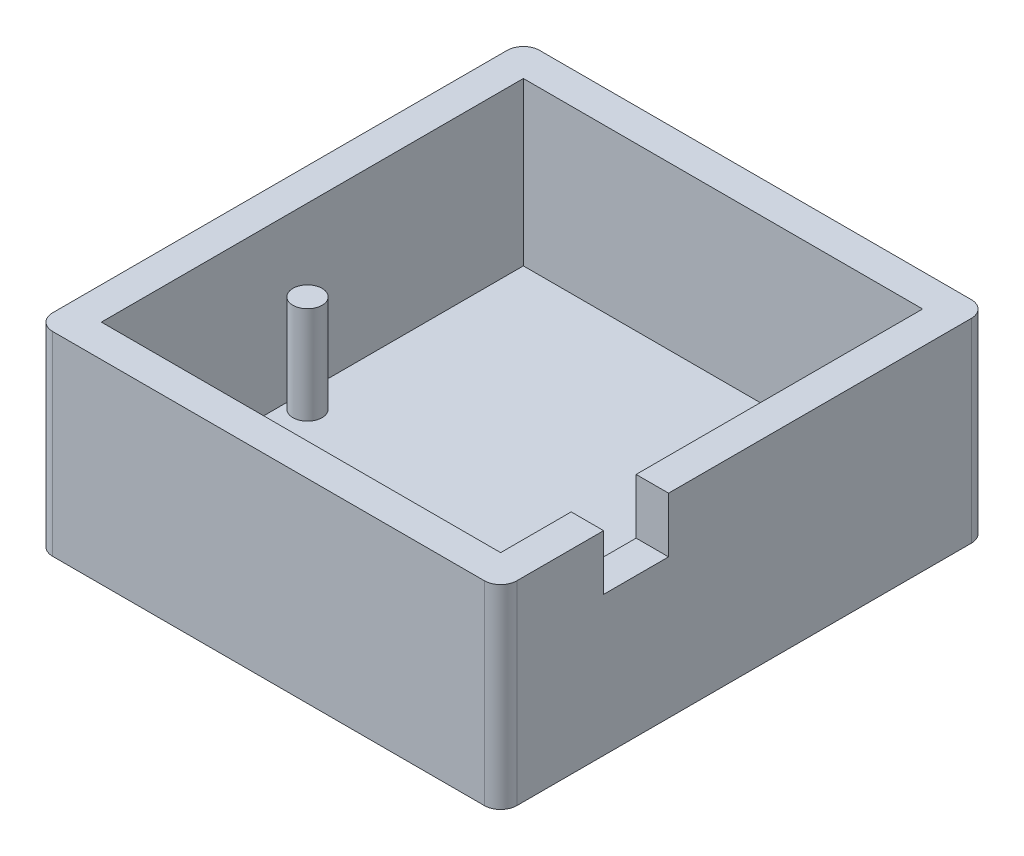
ISO-10303-21;
HEADER;
FILE_DESCRIPTION(('STEP AP214'),'2;1');
FILE_NAME('part.step','',(''),(''),'','','');
FILE_SCHEMA(('AUTOMOTIVE_DESIGN { 1 0 10303 214 1 1 1 1 }'));
ENDSEC;
DATA;
#1=APPLICATION_CONTEXT('core data for automotive mechanical design processes');
#2=APPLICATION_PROTOCOL_DEFINITION('international standard','automotive_design',2000,#1);
#3=PRODUCT_CONTEXT('',#1,'mechanical');
#4=PRODUCT('Part','Part','',(#3));
#5=PRODUCT_RELATED_PRODUCT_CATEGORY('part','',(#4));
#6=PRODUCT_DEFINITION_FORMATION('','',#4);
#7=PRODUCT_DEFINITION_CONTEXT('part definition',#1,'design');
#8=PRODUCT_DEFINITION('design','',#6,#7);
#9=PRODUCT_DEFINITION_SHAPE('','',#8);
#10=(LENGTH_UNIT() NAMED_UNIT(*) SI_UNIT(.MILLI.,.METRE.));
#11=(NAMED_UNIT(*) PLANE_ANGLE_UNIT() SI_UNIT($,.RADIAN.));
#12=(NAMED_UNIT(*) SI_UNIT($,.STERADIAN.) SOLID_ANGLE_UNIT());
#13=UNCERTAINTY_MEASURE_WITH_UNIT(LENGTH_MEASURE(1.E-05),#10,'distance_accuracy_value','');
#14=(GEOMETRIC_REPRESENTATION_CONTEXT(3) GLOBAL_UNCERTAINTY_ASSIGNED_CONTEXT((#13)) GLOBAL_UNIT_ASSIGNED_CONTEXT((#10,
#11,#12)) REPRESENTATION_CONTEXT('',''));
#15=CARTESIAN_POINT('',(0.,0.,0.));
#16=DIRECTION('',(0.,0.,1.));
#17=DIRECTION('',(1.,0.,0.));
#18=AXIS2_PLACEMENT_3D('',#15,#16,#17);
#19=CARTESIAN_POINT('',(0.,20.,0.));
#20=DIRECTION('',(0.,-1.,0.));
#21=DIRECTION('',(0.,0.,-1.));
#22=AXIS2_PLACEMENT_3D('',#19,#20,#21);
#23=PLANE('',#22);
#24=DIRECTION('',(-1.,0.,0.));
#25=VECTOR('',#24,1.);
#26=CARTESIAN_POINT('',(31.8316080107852,20.,9.30673408903629));
#27=LINE('',#26,#25);
#28=CARTESIAN_POINT('',(28.6,20.,9.30673408903629));
#29=VERTEX_POINT('',#28);
#30=CARTESIAN_POINT('',(24.6,20.,9.30673408903629));
#31=VERTEX_POINT('',#30);
#32=EDGE_CURVE('E162',#29,#31,#27,.T.);
#33=ORIENTED_EDGE('',*,*,#32,.F.);
#34=DIRECTION('',(0.,0.,-1.));
#35=VECTOR('',#34,1.);
#36=CARTESIAN_POINT('',(28.6,20.,0.));
#37=LINE('',#36,#35);
#38=CARTESIAN_POINT('',(28.6,20.,-28.));
#39=VERTEX_POINT('',#38);
#40=EDGE_CURVE('E230',#29,#39,#37,.T.);
#41=ORIENTED_EDGE('',*,*,#40,.T.);
#42=CARTESIAN_POINT('',(26.6,20.,-28.));
#43=DIRECTION('',(0.,-1.,0.));
#44=DIRECTION('',(0.,0.,-1.));
#45=AXIS2_PLACEMENT_3D('',#42,#43,#44);
#46=CIRCLE('',#45,2.);
#47=CARTESIAN_POINT('',(26.6,20.,-30.));
#48=VERTEX_POINT('',#47);
#49=EDGE_CURVE('E199',#39,#48,#46,.F.);
#50=ORIENTED_EDGE('',*,*,#49,.T.);
#51=DIRECTION('',(-1.,0.,0.));
#52=VECTOR('',#51,1.);
#53=CARTESIAN_POINT('',(0.,20.,-30.));
#54=LINE('',#53,#52);
#55=CARTESIAN_POINT('',(-26.6,20.,-30.));
#56=VERTEX_POINT('',#55);
#57=EDGE_CURVE('E224',#48,#56,#54,.T.);
#58=ORIENTED_EDGE('',*,*,#57,.T.);
#59=CARTESIAN_POINT('',(-26.6,20.,-28.));
#60=DIRECTION('',(0.,-1.,0.));
#61=DIRECTION('',(0.,0.,-1.));
#62=AXIS2_PLACEMENT_3D('',#59,#60,#61);
#63=CIRCLE('',#62,2.);
#64=CARTESIAN_POINT('',(-28.6,20.,-28.));
#65=VERTEX_POINT('',#64);
#66=EDGE_CURVE('E190',#56,#65,#63,.F.);
#67=ORIENTED_EDGE('',*,*,#66,.T.);
#68=DIRECTION('',(0.,0.,1.));
#69=VECTOR('',#68,1.);
#70=CARTESIAN_POINT('',(-28.6,20.,0.));
#71=LINE('',#70,#69);
#72=CARTESIAN_POINT('',(-28.6,20.,28.));
#73=VERTEX_POINT('',#72);
#74=EDGE_CURVE('E222',#65,#73,#71,.T.);
#75=ORIENTED_EDGE('',*,*,#74,.T.);
#76=CARTESIAN_POINT('',(-26.6,20.,28.));
#77=DIRECTION('',(0.,-1.,0.));
#78=DIRECTION('',(0.,0.,-1.));
#79=AXIS2_PLACEMENT_3D('',#76,#77,#78);
#80=CIRCLE('',#79,2.);
#81=CARTESIAN_POINT('',(-26.6,20.,30.));
#82=VERTEX_POINT('',#81);
#83=EDGE_CURVE('E182',#73,#82,#80,.F.);
#84=ORIENTED_EDGE('',*,*,#83,.T.);
#85=DIRECTION('',(1.,0.,0.));
#86=VECTOR('',#85,1.);
#87=CARTESIAN_POINT('',(0.,20.,30.));
#88=LINE('',#87,#86);
#89=CARTESIAN_POINT('',(26.6,20.,30.));
#90=VERTEX_POINT('',#89);
#91=EDGE_CURVE('E220',#82,#90,#88,.T.);
#92=ORIENTED_EDGE('',*,*,#91,.T.);
#93=CARTESIAN_POINT('',(26.6,20.,28.));
#94=DIRECTION('',(0.,-1.,0.));
#95=DIRECTION('',(0.,0.,-1.));
#96=AXIS2_PLACEMENT_3D('',#93,#94,#95);
#97=CIRCLE('',#96,2.);
#98=CARTESIAN_POINT('',(28.6,20.,28.));
#99=VERTEX_POINT('',#98);
#100=EDGE_CURVE('E209',#90,#99,#97,.F.);
#101=ORIENTED_EDGE('',*,*,#100,.T.);
#102=CARTESIAN_POINT('',(28.6,20.,17.3067340890363));
#103=VERTEX_POINT('',#102);
#104=EDGE_CURVE('E227',#99,#103,#37,.T.);
#105=ORIENTED_EDGE('',*,*,#104,.T.);
#106=DIRECTION('',(1.,0.,0.));
#107=VECTOR('',#106,1.);
#108=CARTESIAN_POINT('',(31.8316080107852,20.,17.3067340890363));
#109=LINE('',#108,#107);
#110=CARTESIAN_POINT('',(24.6,20.,17.3067340890363));
#111=VERTEX_POINT('',#110);
#112=EDGE_CURVE('E155',#111,#103,#109,.T.);
#113=ORIENTED_EDGE('',*,*,#112,.F.);
#114=DIRECTION('',(0.,0.,-1.));
#115=VECTOR('',#114,1.);
#116=CARTESIAN_POINT('',(24.6,20.,26.));
#117=LINE('',#116,#115);
#118=CARTESIAN_POINT('',(24.6,20.,26.));
#119=VERTEX_POINT('',#118);
#120=EDGE_CURVE('E168',#119,#111,#117,.T.);
#121=ORIENTED_EDGE('',*,*,#120,.F.);
#122=DIRECTION('',(1.,0.,0.));
#123=VECTOR('',#122,1.);
#124=CARTESIAN_POINT('',(-24.6,20.,26.));
#125=LINE('',#124,#123);
#126=CARTESIAN_POINT('',(-24.6,20.,26.));
#127=VERTEX_POINT('',#126);
#128=EDGE_CURVE('E253',#127,#119,#125,.T.);
#129=ORIENTED_EDGE('',*,*,#128,.F.);
#130=DIRECTION('',(0.,0.,1.));
#131=VECTOR('',#130,1.);
#132=CARTESIAN_POINT('',(-24.6,20.,26.));
#133=LINE('',#132,#131);
#134=CARTESIAN_POINT('',(-24.6,20.,-26.));
#135=VERTEX_POINT('',#134);
#136=EDGE_CURVE('E266',#135,#127,#133,.T.);
#137=ORIENTED_EDGE('',*,*,#136,.F.);
#138=DIRECTION('',(-1.,0.,0.));
#139=VECTOR('',#138,1.);
#140=CARTESIAN_POINT('',(-24.6,20.,-26.));
#141=LINE('',#140,#139);
#142=CARTESIAN_POINT('',(24.6,20.,-26.));
#143=VERTEX_POINT('',#142);
#144=EDGE_CURVE('E269',#143,#135,#141,.T.);
#145=ORIENTED_EDGE('',*,*,#144,.F.);
#146=EDGE_CURVE('E256',#31,#143,#117,.T.);
#147=ORIENTED_EDGE('',*,*,#146,.F.);
#148=EDGE_LOOP('',(#33,#41,#50,#58,#67,#75,#84,#92,#101,#105,#113,#121,#129,#137,#145,#147));
#149=FACE_BOUND('',#148,.T.);
#150=ADVANCED_FACE('F33',(#149),#23,.F.);
#151=CARTESIAN_POINT('',(28.6,20.,26.));
#152=DIRECTION('',(-1.,0.,0.));
#153=DIRECTION('',(0.,0.,1.));
#154=AXIS2_PLACEMENT_3D('',#151,#152,#153);
#155=PLANE('',#154);
#156=DIRECTION('',(0.,1.,0.));
#157=VECTOR('',#156,1.);
#158=CARTESIAN_POINT('',(28.6,20.,9.30673408903629));
#159=LINE('',#158,#157);
#160=CARTESIAN_POINT('',(28.6,13.2,9.30673408903629));
#161=VERTEX_POINT('',#160);
#162=EDGE_CURVE('E283',#161,#29,#159,.T.);
#163=ORIENTED_EDGE('',*,*,#162,.F.);
#164=DIRECTION('',(0.,0.,1.));
#165=VECTOR('',#164,1.);
#166=CARTESIAN_POINT('',(28.6,13.2,26.));
#167=LINE('',#166,#165);
#168=CARTESIAN_POINT('',(28.6,13.2,17.3067340890363));
#169=VERTEX_POINT('',#168);
#170=EDGE_CURVE('E154',#161,#169,#167,.T.);
#171=ORIENTED_EDGE('',*,*,#170,.T.);
#172=DIRECTION('',(0.,-1.,0.));
#173=VECTOR('',#172,1.);
#174=CARTESIAN_POINT('',(28.6,20.,17.3067340890363));
#175=LINE('',#174,#173);
#176=EDGE_CURVE('E161',#103,#169,#175,.T.);
#177=ORIENTED_EDGE('',*,*,#176,.F.);
#178=ORIENTED_EDGE('',*,*,#104,.F.);
#179=DIRECTION('',(0.,-1.,0.));
#180=VECTOR('',#179,1.);
#181=CARTESIAN_POINT('',(28.6,20.,28.));
#182=LINE('',#181,#180);
#183=CARTESIAN_POINT('',(28.6,-4.,28.));
#184=VERTEX_POINT('',#183);
#185=EDGE_CURVE('E217',#99,#184,#182,.T.);
#186=ORIENTED_EDGE('',*,*,#185,.T.);
#187=DIRECTION('',(0.,0.,-1.));
#188=VECTOR('',#187,1.);
#189=CARTESIAN_POINT('',(28.6,-4.,0.));
#190=LINE('',#189,#188);
#191=CARTESIAN_POINT('',(28.6,-4.,-28.));
#192=VERTEX_POINT('',#191);
#193=EDGE_CURVE('E238',#184,#192,#190,.T.);
#194=ORIENTED_EDGE('',*,*,#193,.T.);
#195=DIRECTION('',(0.,-1.,0.));
#196=VECTOR('',#195,1.);
#197=CARTESIAN_POINT('',(28.6,20.,-28.));
#198=LINE('',#197,#196);
#199=EDGE_CURVE('E201',#192,#39,#198,.F.);
#200=ORIENTED_EDGE('',*,*,#199,.T.);
#201=ORIENTED_EDGE('',*,*,#40,.F.);
#202=EDGE_LOOP('',(#163,#171,#177,#178,#186,#194,#200,#201));
#203=FACE_BOUND('',#202,.T.);
#204=ADVANCED_FACE('F314',(#203),#155,.F.);
#205=CARTESIAN_POINT('',(24.6,20.,26.));
#206=DIRECTION('',(-1.,0.,0.));
#207=DIRECTION('',(0.,0.,1.));
#208=AXIS2_PLACEMENT_3D('',#205,#206,#207);
#209=PLANE('',#208);
#210=DIRECTION('',(0.,0.,-1.));
#211=VECTOR('',#210,1.);
#212=CARTESIAN_POINT('',(24.6,13.2,26.));
#213=LINE('',#212,#211);
#214=CARTESIAN_POINT('',(24.6,13.2,17.3067340890363));
#215=VERTEX_POINT('',#214);
#216=CARTESIAN_POINT('',(24.6,13.2,9.30673408903629));
#217=VERTEX_POINT('',#216);
#218=EDGE_CURVE('E147',#215,#217,#213,.T.);
#219=ORIENTED_EDGE('',*,*,#218,.T.);
#220=DIRECTION('',(0.,1.,0.));
#221=VECTOR('',#220,1.);
#222=CARTESIAN_POINT('',(24.6,20.,9.30673408903629));
#223=LINE('',#222,#221);
#224=EDGE_CURVE('E11',#217,#31,#223,.T.);
#225=ORIENTED_EDGE('',*,*,#224,.T.);
#226=ORIENTED_EDGE('',*,*,#146,.T.);
#227=DIRECTION('',(0.,-1.,0.));
#228=VECTOR('',#227,1.);
#229=CARTESIAN_POINT('',(24.6,20.,-26.));
#230=LINE('',#229,#228);
#231=CARTESIAN_POINT('',(24.6,0.,-26.));
#232=VERTEX_POINT('',#231);
#233=EDGE_CURVE('E241',#143,#232,#230,.T.);
#234=ORIENTED_EDGE('',*,*,#233,.T.);
#235=DIRECTION('',(0.,0.,-1.));
#236=VECTOR('',#235,1.);
#237=CARTESIAN_POINT('',(24.6,0.,26.));
#238=LINE('',#237,#236);
#239=CARTESIAN_POINT('',(24.6,0.,26.));
#240=VERTEX_POINT('',#239);
#241=EDGE_CURVE('E261',#240,#232,#238,.T.);
#242=ORIENTED_EDGE('',*,*,#241,.F.);
#243=DIRECTION('',(0.,-1.,0.));
#244=VECTOR('',#243,1.);
#245=CARTESIAN_POINT('',(24.6,20.,26.));
#246=LINE('',#245,#244);
#247=EDGE_CURVE('E250',#119,#240,#246,.T.);
#248=ORIENTED_EDGE('',*,*,#247,.F.);
#249=ORIENTED_EDGE('',*,*,#120,.T.);
#250=DIRECTION('',(0.,-1.,0.));
#251=VECTOR('',#250,1.);
#252=CARTESIAN_POINT('',(24.6,20.,17.3067340890363));
#253=LINE('',#252,#251);
#254=EDGE_CURVE('E41',#111,#215,#253,.T.);
#255=ORIENTED_EDGE('',*,*,#254,.T.);
#256=EDGE_LOOP('',(#219,#225,#226,#234,#242,#248,#249,#255));
#257=FACE_BOUND('',#256,.T.);
#258=ADVANCED_FACE('F165',(#257),#209,.T.);
#259=CARTESIAN_POINT('',(0.,0.,0.));
#260=DIRECTION('',(0.,-1.,0.));
#261=DIRECTION('',(0.,0.,-1.));
#262=AXIS2_PLACEMENT_3D('',#259,#260,#261);
#263=PLANE('',#262);
#264=CARTESIAN_POINT('',(-22.6,0.,24.));
#265=DIRECTION('',(0.,-1.,0.));
#266=DIRECTION('',(0.,0.,-1.));
#267=AXIS2_PLACEMENT_3D('',#264,#265,#266);
#268=CIRCLE('',#267,1.8);
#269=CARTESIAN_POINT('',(-22.6,0.,22.2));
#270=VERTEX_POINT('',#269);
#271=EDGE_CURVE('E171',#270,#270,#268,.F.);
#272=ORIENTED_EDGE('',*,*,#271,.F.);
#273=EDGE_LOOP('',(#272));
#274=FACE_BOUND('',#273,.T.);
#275=CARTESIAN_POINT('',(-22.6,0.,2.6));
#276=DIRECTION('',(0.,-1.,0.));
#277=DIRECTION('',(0.,0.,-1.));
#278=AXIS2_PLACEMENT_3D('',#275,#276,#277);
#279=CIRCLE('',#278,1.8);
#280=CARTESIAN_POINT('',(-22.6,0.,0.800000000000004));
#281=VERTEX_POINT('',#280);
#282=EDGE_CURVE('E179',#281,#281,#279,.F.);
#283=ORIENTED_EDGE('',*,*,#282,.F.);
#284=EDGE_LOOP('',(#283));
#285=FACE_BOUND('',#284,.T.);
#286=ORIENTED_EDGE('',*,*,#241,.T.);
#287=DIRECTION('',(-1.,0.,0.));
#288=VECTOR('',#287,1.);
#289=CARTESIAN_POINT('',(-24.6,0.,-26.));
#290=LINE('',#289,#288);
#291=CARTESIAN_POINT('',(-24.6,0.,-26.));
#292=VERTEX_POINT('',#291);
#293=EDGE_CURVE('E259',#232,#292,#290,.T.);
#294=ORIENTED_EDGE('',*,*,#293,.T.);
#295=DIRECTION('',(0.,0.,1.));
#296=VECTOR('',#295,1.);
#297=CARTESIAN_POINT('',(-24.6,0.,26.));
#298=LINE('',#297,#296);
#299=CARTESIAN_POINT('',(-24.6,0.,26.));
#300=VERTEX_POINT('',#299);
#301=EDGE_CURVE('E257',#292,#300,#298,.T.);
#302=ORIENTED_EDGE('',*,*,#301,.T.);
#303=DIRECTION('',(1.,0.,0.));
#304=VECTOR('',#303,1.);
#305=CARTESIAN_POINT('',(-24.6,0.,26.));
#306=LINE('',#305,#304);
#307=EDGE_CURVE('E254',#300,#240,#306,.T.);
#308=ORIENTED_EDGE('',*,*,#307,.T.);
#309=EDGE_LOOP('',(#286,#294,#302,#308));
#310=FACE_BOUND('',#309,.T.);
#311=CARTESIAN_POINT('',(22.6,0.,2.6));
#312=DIRECTION('',(0.,-1.,0.));
#313=DIRECTION('',(0.,0.,-1.));
#314=AXIS2_PLACEMENT_3D('',#311,#312,#313);
#315=CIRCLE('',#314,1.8);
#316=CARTESIAN_POINT('',(22.6,0.,0.800000000000004));
#317=VERTEX_POINT('',#316);
#318=EDGE_CURVE('E176',#317,#317,#315,.F.);
#319=ORIENTED_EDGE('',*,*,#318,.F.);
#320=EDGE_LOOP('',(#319));
#321=FACE_BOUND('',#320,.T.);
#322=CARTESIAN_POINT('',(22.6,0.,24.));
#323=DIRECTION('',(0.,-1.,0.));
#324=DIRECTION('',(0.,0.,-1.));
#325=AXIS2_PLACEMENT_3D('',#322,#323,#324);
#326=CIRCLE('',#325,1.8);
#327=CARTESIAN_POINT('',(22.6,0.,22.2));
#328=VERTEX_POINT('',#327);
#329=EDGE_CURVE('E169',#328,#328,#326,.F.);
#330=ORIENTED_EDGE('',*,*,#329,.F.);
#331=EDGE_LOOP('',(#330));
#332=FACE_BOUND('',#331,.T.);
#333=ADVANCED_FACE('F308',(#274,#285,#310,#321,#332),#263,.F.);
#334=CARTESIAN_POINT('',(-24.6,20.,-30.));
#335=DIRECTION('',(0.,0.,1.));
#336=DIRECTION('',(1.,0.,0.));
#337=AXIS2_PLACEMENT_3D('',#334,#335,#336);
#338=PLANE('',#337);
#339=DIRECTION('',(-1.,0.,0.));
#340=VECTOR('',#339,1.);
#341=CARTESIAN_POINT('',(0.,-4.,-30.));
#342=LINE('',#341,#340);
#343=CARTESIAN_POINT('',(26.6,-4.,-30.));
#344=VERTEX_POINT('',#343);
#345=CARTESIAN_POINT('',(-26.6,-4.,-30.));
#346=VERTEX_POINT('',#345);
#347=EDGE_CURVE('E235',#344,#346,#342,.T.);
#348=ORIENTED_EDGE('',*,*,#347,.T.);
#349=DIRECTION('',(0.,-1.,0.));
#350=VECTOR('',#349,1.);
#351=CARTESIAN_POINT('',(-26.6,20.,-30.));
#352=LINE('',#351,#350);
#353=EDGE_CURVE('E192',#346,#56,#352,.F.);
#354=ORIENTED_EDGE('',*,*,#353,.T.);
#355=ORIENTED_EDGE('',*,*,#57,.F.);
#356=DIRECTION('',(0.,-1.,0.));
#357=VECTOR('',#356,1.);
#358=CARTESIAN_POINT('',(26.6,20.,-30.));
#359=LINE('',#358,#357);
#360=EDGE_CURVE('E206',#48,#344,#359,.T.);
#361=ORIENTED_EDGE('',*,*,#360,.T.);
#362=EDGE_LOOP('',(#348,#354,#355,#361));
#363=FACE_BOUND('',#362,.T.);
#364=ADVANCED_FACE('F323',(#363),#338,.F.);
#365=CARTESIAN_POINT('',(-28.6,20.,26.));
#366=DIRECTION('',(1.,0.,0.));
#367=DIRECTION('',(0.,0.,-1.));
#368=AXIS2_PLACEMENT_3D('',#365,#366,#367);
#369=PLANE('',#368);
#370=DIRECTION('',(0.,0.,1.));
#371=VECTOR('',#370,1.);
#372=CARTESIAN_POINT('',(-28.6,-4.,0.));
#373=LINE('',#372,#371);
#374=CARTESIAN_POINT('',(-28.6,-4.,-28.));
#375=VERTEX_POINT('',#374);
#376=CARTESIAN_POINT('',(-28.6,-4.,28.));
#377=VERTEX_POINT('',#376);
#378=EDGE_CURVE('E233',#375,#377,#373,.T.);
#379=ORIENTED_EDGE('',*,*,#378,.T.);
#380=DIRECTION('',(0.,-1.,0.));
#381=VECTOR('',#380,1.);
#382=CARTESIAN_POINT('',(-28.6,20.,28.));
#383=LINE('',#382,#381);
#384=EDGE_CURVE('E56',#377,#73,#383,.F.);
#385=ORIENTED_EDGE('',*,*,#384,.T.);
#386=ORIENTED_EDGE('',*,*,#74,.F.);
#387=DIRECTION('',(0.,-1.,0.));
#388=VECTOR('',#387,1.);
#389=CARTESIAN_POINT('',(-28.6,20.,-28.));
#390=LINE('',#389,#388);
#391=EDGE_CURVE('E196',#65,#375,#390,.T.);
#392=ORIENTED_EDGE('',*,*,#391,.T.);
#393=EDGE_LOOP('',(#379,#385,#386,#392));
#394=FACE_BOUND('',#393,.T.);
#395=ADVANCED_FACE('F343',(#394),#369,.F.);
#396=CARTESIAN_POINT('',(-24.6,20.,30.));
#397=DIRECTION('',(0.,0.,-1.));
#398=DIRECTION('',(-1.,0.,0.));
#399=AXIS2_PLACEMENT_3D('',#396,#397,#398);
#400=PLANE('',#399);
#401=ORIENTED_EDGE('',*,*,#91,.F.);
#402=DIRECTION('',(0.,-1.,0.));
#403=VECTOR('',#402,1.);
#404=CARTESIAN_POINT('',(-26.6,20.,30.));
#405=LINE('',#404,#403);
#406=CARTESIAN_POINT('',(-26.6,-4.,30.));
#407=VERTEX_POINT('',#406);
#408=EDGE_CURVE('E187',#82,#407,#405,.T.);
#409=ORIENTED_EDGE('',*,*,#408,.T.);
#410=DIRECTION('',(1.,0.,0.));
#411=VECTOR('',#410,1.);
#412=CARTESIAN_POINT('',(0.,-4.,30.));
#413=LINE('',#412,#411);
#414=CARTESIAN_POINT('',(26.6,-4.,30.));
#415=VERTEX_POINT('',#414);
#416=EDGE_CURVE('E231',#407,#415,#413,.T.);
#417=ORIENTED_EDGE('',*,*,#416,.T.);
#418=DIRECTION('',(0.,-1.,0.));
#419=VECTOR('',#418,1.);
#420=CARTESIAN_POINT('',(26.6,20.,30.));
#421=LINE('',#420,#419);
#422=EDGE_CURVE('E211',#415,#90,#421,.F.);
#423=ORIENTED_EDGE('',*,*,#422,.T.);
#424=EDGE_LOOP('',(#401,#409,#417,#423));
#425=FACE_BOUND('',#424,.T.);
#426=ADVANCED_FACE('F338',(#425),#400,.F.);
#427=CARTESIAN_POINT('',(0.,-4.,0.));
#428=DIRECTION('',(0.,-1.,0.));
#429=DIRECTION('',(0.,0.,-1.));
#430=AXIS2_PLACEMENT_3D('',#427,#428,#429);
#431=PLANE('',#430);
#432=ORIENTED_EDGE('',*,*,#416,.F.);
#433=CARTESIAN_POINT('',(-26.6,-4.,28.));
#434=DIRECTION('',(0.,-1.,0.));
#435=DIRECTION('',(0.,0.,-1.));
#436=AXIS2_PLACEMENT_3D('',#433,#434,#435);
#437=CIRCLE('',#436,2.);
#438=EDGE_CURVE('E185',#407,#377,#437,.T.);
#439=ORIENTED_EDGE('',*,*,#438,.T.);
#440=ORIENTED_EDGE('',*,*,#378,.F.);
#441=CARTESIAN_POINT('',(-26.6,-4.,-28.));
#442=DIRECTION('',(0.,-1.,0.));
#443=DIRECTION('',(0.,0.,-1.));
#444=AXIS2_PLACEMENT_3D('',#441,#442,#443);
#445=CIRCLE('',#444,2.);
#446=EDGE_CURVE('E194',#375,#346,#445,.T.);
#447=ORIENTED_EDGE('',*,*,#446,.T.);
#448=ORIENTED_EDGE('',*,*,#347,.F.);
#449=CARTESIAN_POINT('',(26.6,-4.,-28.));
#450=DIRECTION('',(0.,-1.,0.));
#451=DIRECTION('',(0.,0.,-1.));
#452=AXIS2_PLACEMENT_3D('',#449,#450,#451);
#453=CIRCLE('',#452,2.);
#454=EDGE_CURVE('E204',#344,#192,#453,.T.);
#455=ORIENTED_EDGE('',*,*,#454,.T.);
#456=ORIENTED_EDGE('',*,*,#193,.F.);
#457=CARTESIAN_POINT('',(26.6,-4.,28.));
#458=DIRECTION('',(0.,-1.,0.));
#459=DIRECTION('',(0.,0.,-1.));
#460=AXIS2_PLACEMENT_3D('',#457,#458,#459);
#461=CIRCLE('',#460,2.);
#462=EDGE_CURVE('E214',#184,#415,#461,.T.);
#463=ORIENTED_EDGE('',*,*,#462,.T.);
#464=EDGE_LOOP('',(#432,#439,#440,#447,#448,#455,#456,#463));
#465=FACE_BOUND('',#464,.T.);
#466=ADVANCED_FACE('F330',(#465),#431,.T.);
#467=CARTESIAN_POINT('',(-24.6,20.,-26.));
#468=DIRECTION('',(0.,0.,1.));
#469=DIRECTION('',(1.,0.,0.));
#470=AXIS2_PLACEMENT_3D('',#467,#468,#469);
#471=PLANE('',#470);
#472=ORIENTED_EDGE('',*,*,#293,.F.);
#473=ORIENTED_EDGE('',*,*,#233,.F.);
#474=ORIENTED_EDGE('',*,*,#144,.T.);
#475=DIRECTION('',(0.,-1.,0.));
#476=VECTOR('',#475,1.);
#477=CARTESIAN_POINT('',(-24.6,20.,-26.));
#478=LINE('',#477,#476);
#479=EDGE_CURVE('E244',#135,#292,#478,.T.);
#480=ORIENTED_EDGE('',*,*,#479,.T.);
#481=EDGE_LOOP('',(#472,#473,#474,#480));
#482=FACE_BOUND('',#481,.T.);
#483=ADVANCED_FACE('F302',(#482),#471,.T.);
#484=CARTESIAN_POINT('',(-24.6,20.,26.));
#485=DIRECTION('',(1.,0.,0.));
#486=DIRECTION('',(0.,0.,-1.));
#487=AXIS2_PLACEMENT_3D('',#484,#485,#486);
#488=PLANE('',#487);
#489=ORIENTED_EDGE('',*,*,#301,.F.);
#490=ORIENTED_EDGE('',*,*,#479,.F.);
#491=ORIENTED_EDGE('',*,*,#136,.T.);
#492=DIRECTION('',(0.,-1.,0.));
#493=VECTOR('',#492,1.);
#494=CARTESIAN_POINT('',(-24.6,20.,26.));
#495=LINE('',#494,#493);
#496=EDGE_CURVE('E247',#127,#300,#495,.T.);
#497=ORIENTED_EDGE('',*,*,#496,.T.);
#498=EDGE_LOOP('',(#489,#490,#491,#497));
#499=FACE_BOUND('',#498,.T.);
#500=ADVANCED_FACE('F305',(#499),#488,.T.);
#501=CARTESIAN_POINT('',(-24.6,20.,26.));
#502=DIRECTION('',(0.,0.,-1.));
#503=DIRECTION('',(-1.,0.,0.));
#504=AXIS2_PLACEMENT_3D('',#501,#502,#503);
#505=PLANE('',#504);
#506=ORIENTED_EDGE('',*,*,#307,.F.);
#507=ORIENTED_EDGE('',*,*,#496,.F.);
#508=ORIENTED_EDGE('',*,*,#128,.T.);
#509=ORIENTED_EDGE('',*,*,#247,.T.);
#510=EDGE_LOOP('',(#506,#507,#508,#509));
#511=FACE_BOUND('',#510,.T.);
#512=ADVANCED_FACE('F371',(#511),#505,.T.);
#513=CARTESIAN_POINT('',(26.6,20.,28.));
#514=DIRECTION('',(0.,-1.,0.));
#515=DIRECTION('',(0.,0.,-1.));
#516=AXIS2_PLACEMENT_3D('',#513,#514,#515);
#517=CYLINDRICAL_SURFACE('',#516,2.);
#518=ORIENTED_EDGE('',*,*,#100,.F.);
#519=ORIENTED_EDGE('',*,*,#422,.F.);
#520=ORIENTED_EDGE('',*,*,#462,.F.);
#521=ORIENTED_EDGE('',*,*,#185,.F.);
#522=EDGE_LOOP('',(#518,#519,#520,#521));
#523=FACE_BOUND('',#522,.T.);
#524=ADVANCED_FACE('F333',(#523),#517,.T.);
#525=CARTESIAN_POINT('',(26.6,20.,-28.));
#526=DIRECTION('',(0.,-1.,0.));
#527=DIRECTION('',(0.,0.,-1.));
#528=AXIS2_PLACEMENT_3D('',#525,#526,#527);
#529=CYLINDRICAL_SURFACE('',#528,2.);
#530=ORIENTED_EDGE('',*,*,#49,.F.);
#531=ORIENTED_EDGE('',*,*,#199,.F.);
#532=ORIENTED_EDGE('',*,*,#454,.F.);
#533=ORIENTED_EDGE('',*,*,#360,.F.);
#534=EDGE_LOOP('',(#530,#531,#532,#533));
#535=FACE_BOUND('',#534,.T.);
#536=ADVANCED_FACE('F326',(#535),#529,.T.);
#537=CARTESIAN_POINT('',(-26.6,20.,-28.));
#538=DIRECTION('',(0.,-1.,0.));
#539=DIRECTION('',(0.,0.,-1.));
#540=AXIS2_PLACEMENT_3D('',#537,#538,#539);
#541=CYLINDRICAL_SURFACE('',#540,2.);
#542=ORIENTED_EDGE('',*,*,#66,.F.);
#543=ORIENTED_EDGE('',*,*,#353,.F.);
#544=ORIENTED_EDGE('',*,*,#446,.F.);
#545=ORIENTED_EDGE('',*,*,#391,.F.);
#546=EDGE_LOOP('',(#542,#543,#544,#545));
#547=FACE_BOUND('',#546,.T.);
#548=ADVANCED_FACE('F345',(#547),#541,.T.);
#549=CARTESIAN_POINT('',(-26.6,20.,28.));
#550=DIRECTION('',(0.,-1.,0.));
#551=DIRECTION('',(0.,0.,-1.));
#552=AXIS2_PLACEMENT_3D('',#549,#550,#551);
#553=CYLINDRICAL_SURFACE('',#552,2.);
#554=ORIENTED_EDGE('',*,*,#83,.F.);
#555=ORIENTED_EDGE('',*,*,#384,.F.);
#556=ORIENTED_EDGE('',*,*,#438,.F.);
#557=ORIENTED_EDGE('',*,*,#408,.F.);
#558=EDGE_LOOP('',(#554,#555,#556,#557));
#559=FACE_BOUND('',#558,.T.);
#560=ADVANCED_FACE('F35',(#559),#553,.T.);
#561=CARTESIAN_POINT('',(-22.6,12.,2.6));
#562=DIRECTION('',(0.,-1.,0.));
#563=DIRECTION('',(0.,0.,-1.));
#564=AXIS2_PLACEMENT_3D('',#561,#562,#563);
#565=CYLINDRICAL_SURFACE('',#564,1.8);
#566=CARTESIAN_POINT('',(-22.6,12.,2.6));
#567=DIRECTION('',(0.,1.,0.));
#568=DIRECTION('',(0.,0.,1.));
#569=AXIS2_PLACEMENT_3D('',#566,#567,#568);
#570=CIRCLE('',#569,1.8);
#571=CARTESIAN_POINT('',(-22.6,12.,4.40000000000001));
#572=VERTEX_POINT('',#571);
#573=EDGE_CURVE('E264',#572,#572,#570,.T.);
#574=ORIENTED_EDGE('',*,*,#573,.F.);
#575=EDGE_LOOP('',(#574));
#576=FACE_BOUND('',#575,.T.);
#577=ORIENTED_EDGE('',*,*,#282,.T.);
#578=EDGE_LOOP('',(#577));
#579=FACE_BOUND('',#578,.T.);
#580=ADVANCED_FACE('F351',(#576,#579),#565,.T.);
#581=CARTESIAN_POINT('',(-22.6,12.,2.6));
#582=DIRECTION('',(0.,1.,0.));
#583=DIRECTION('',(0.,0.,1.));
#584=AXIS2_PLACEMENT_3D('',#581,#582,#583);
#585=PLANE('',#584);
#586=ORIENTED_EDGE('',*,*,#573,.T.);
#587=EDGE_LOOP('',(#586));
#588=FACE_BOUND('',#587,.T.);
#589=ADVANCED_FACE('F406',(#588),#585,.T.);
#590=CARTESIAN_POINT('',(22.6,12.,2.6));
#591=DIRECTION('',(0.,-1.,0.));
#592=DIRECTION('',(0.,0.,-1.));
#593=AXIS2_PLACEMENT_3D('',#590,#591,#592);
#594=CYLINDRICAL_SURFACE('',#593,1.8);
#595=CARTESIAN_POINT('',(22.6,12.,2.6));
#596=DIRECTION('',(0.,1.,0.));
#597=DIRECTION('',(0.,0.,1.));
#598=AXIS2_PLACEMENT_3D('',#595,#596,#597);
#599=CIRCLE('',#598,1.8);
#600=CARTESIAN_POINT('',(22.6,12.,4.40000000000001));
#601=VERTEX_POINT('',#600);
#602=EDGE_CURVE('E274',#601,#601,#599,.T.);
#603=ORIENTED_EDGE('',*,*,#602,.F.);
#604=EDGE_LOOP('',(#603));
#605=FACE_BOUND('',#604,.T.);
#606=ORIENTED_EDGE('',*,*,#318,.T.);
#607=EDGE_LOOP('',(#606));
#608=FACE_BOUND('',#607,.T.);
#609=ADVANCED_FACE('F411',(#605,#608),#594,.T.);
#610=CARTESIAN_POINT('',(22.6,12.,2.6));
#611=DIRECTION('',(0.,1.,0.));
#612=DIRECTION('',(0.,0.,1.));
#613=AXIS2_PLACEMENT_3D('',#610,#611,#612);
#614=PLANE('',#613);
#615=ORIENTED_EDGE('',*,*,#602,.T.);
#616=EDGE_LOOP('',(#615));
#617=FACE_BOUND('',#616,.T.);
#618=ADVANCED_FACE('F421',(#617),#614,.T.);
#619=CARTESIAN_POINT('',(-22.6,12.,24.));
#620=DIRECTION('',(0.,-1.,0.));
#621=DIRECTION('',(0.,0.,-1.));
#622=AXIS2_PLACEMENT_3D('',#619,#620,#621);
#623=CYLINDRICAL_SURFACE('',#622,1.8);
#624=CARTESIAN_POINT('',(-22.6,12.,24.));
#625=DIRECTION('',(0.,1.,0.));
#626=DIRECTION('',(0.,0.,1.));
#627=AXIS2_PLACEMENT_3D('',#624,#625,#626);
#628=CIRCLE('',#627,1.8);
#629=CARTESIAN_POINT('',(-22.6,12.,25.8));
#630=VERTEX_POINT('',#629);
#631=EDGE_CURVE('E277',#630,#630,#628,.T.);
#632=ORIENTED_EDGE('',*,*,#631,.F.);
#633=EDGE_LOOP('',(#632));
#634=FACE_BOUND('',#633,.T.);
#635=ORIENTED_EDGE('',*,*,#271,.T.);
#636=EDGE_LOOP('',(#635));
#637=FACE_BOUND('',#636,.T.);
#638=ADVANCED_FACE('F426',(#634,#637),#623,.T.);
#639=CARTESIAN_POINT('',(-22.6,12.,24.));
#640=DIRECTION('',(0.,1.,0.));
#641=DIRECTION('',(0.,0.,1.));
#642=AXIS2_PLACEMENT_3D('',#639,#640,#641);
#643=PLANE('',#642);
#644=ORIENTED_EDGE('',*,*,#631,.T.);
#645=EDGE_LOOP('',(#644));
#646=FACE_BOUND('',#645,.T.);
#647=ADVANCED_FACE('F434',(#646),#643,.T.);
#648=CARTESIAN_POINT('',(22.6,12.,24.));
#649=DIRECTION('',(0.,-1.,0.));
#650=DIRECTION('',(0.,0.,-1.));
#651=AXIS2_PLACEMENT_3D('',#648,#649,#650);
#652=CYLINDRICAL_SURFACE('',#651,1.8);
#653=CARTESIAN_POINT('',(22.6,12.,24.));
#654=DIRECTION('',(0.,1.,0.));
#655=DIRECTION('',(0.,0.,1.));
#656=AXIS2_PLACEMENT_3D('',#653,#654,#655);
#657=CIRCLE('',#656,1.8);
#658=CARTESIAN_POINT('',(22.6,12.,25.8));
#659=VERTEX_POINT('',#658);
#660=EDGE_CURVE('E280',#659,#659,#657,.T.);
#661=ORIENTED_EDGE('',*,*,#660,.F.);
#662=EDGE_LOOP('',(#661));
#663=FACE_BOUND('',#662,.T.);
#664=ORIENTED_EDGE('',*,*,#329,.T.);
#665=EDGE_LOOP('',(#664));
#666=FACE_BOUND('',#665,.T.);
#667=ADVANCED_FACE('F439',(#663,#666),#652,.T.);
#668=CARTESIAN_POINT('',(22.6,12.,24.));
#669=DIRECTION('',(0.,1.,0.));
#670=DIRECTION('',(0.,0.,1.));
#671=AXIS2_PLACEMENT_3D('',#668,#669,#670);
#672=PLANE('',#671);
#673=ORIENTED_EDGE('',*,*,#660,.T.);
#674=EDGE_LOOP('',(#673));
#675=FACE_BOUND('',#674,.T.);
#676=ADVANCED_FACE('F447',(#675),#672,.T.);
#677=CARTESIAN_POINT('',(31.8316080107852,20.,9.30673408903629));
#678=DIRECTION('',(0.,0.,1.));
#679=DIRECTION('',(1.,0.,0.));
#680=AXIS2_PLACEMENT_3D('',#677,#678,#679);
#681=PLANE('',#680);
#682=ORIENTED_EDGE('',*,*,#162,.T.);
#683=ORIENTED_EDGE('',*,*,#32,.T.);
#684=ORIENTED_EDGE('',*,*,#224,.F.);
#685=DIRECTION('',(-1.,0.,0.));
#686=VECTOR('',#685,1.);
#687=CARTESIAN_POINT('',(31.8316080107852,13.2,9.30673408903629));
#688=LINE('',#687,#686);
#689=EDGE_CURVE('E48',#161,#217,#688,.T.);
#690=ORIENTED_EDGE('',*,*,#689,.F.);
#691=EDGE_LOOP('',(#682,#683,#684,#690));
#692=FACE_BOUND('',#691,.T.);
#693=ADVANCED_FACE('F291',(#692),#681,.T.);
#694=CARTESIAN_POINT('',(31.8316080107852,20.,17.3067340890363));
#695=DIRECTION('',(0.,0.,-1.));
#696=DIRECTION('',(-1.,0.,0.));
#697=AXIS2_PLACEMENT_3D('',#694,#695,#696);
#698=PLANE('',#697);
#699=ORIENTED_EDGE('',*,*,#176,.T.);
#700=DIRECTION('',(1.,0.,0.));
#701=VECTOR('',#700,1.);
#702=CARTESIAN_POINT('',(31.8316080107852,13.2,17.3067340890363));
#703=LINE('',#702,#701);
#704=EDGE_CURVE('E150',#215,#169,#703,.T.);
#705=ORIENTED_EDGE('',*,*,#704,.F.);
#706=ORIENTED_EDGE('',*,*,#254,.F.);
#707=ORIENTED_EDGE('',*,*,#112,.T.);
#708=EDGE_LOOP('',(#699,#705,#706,#707));
#709=FACE_BOUND('',#708,.T.);
#710=ADVANCED_FACE('F158',(#709),#698,.T.);
#711=CARTESIAN_POINT('',(0.,13.2,13.3));
#712=DIRECTION('',(0.,-1.,0.));
#713=DIRECTION('',(0.,0.,-1.));
#714=AXIS2_PLACEMENT_3D('',#711,#712,#713);
#715=PLANE('',#714);
#716=ORIENTED_EDGE('',*,*,#689,.T.);
#717=ORIENTED_EDGE('',*,*,#218,.F.);
#718=ORIENTED_EDGE('',*,*,#704,.T.);
#719=ORIENTED_EDGE('',*,*,#170,.F.);
#720=EDGE_LOOP('',(#716,#717,#718,#719));
#721=FACE_BOUND('',#720,.T.);
#722=ADVANCED_FACE('F149',(#721),#715,.F.);
#723=CLOSED_SHELL('',(#150,#204,#258,#333,#364,#395,#426,#466,#483,#500,#512,#524,#536,#548,
#560,#580,#589,#609,#618,#638,#647,#667,#676,#693,#710,#722));
#724=MANIFOLD_SOLID_BREP('B2',#723);
#725=ADVANCED_BREP_SHAPE_REPRESENTATION('',(#18,#724),#14);
#726=SHAPE_DEFINITION_REPRESENTATION(#9,#725);
ENDSEC;
END-ISO-10303-21;
